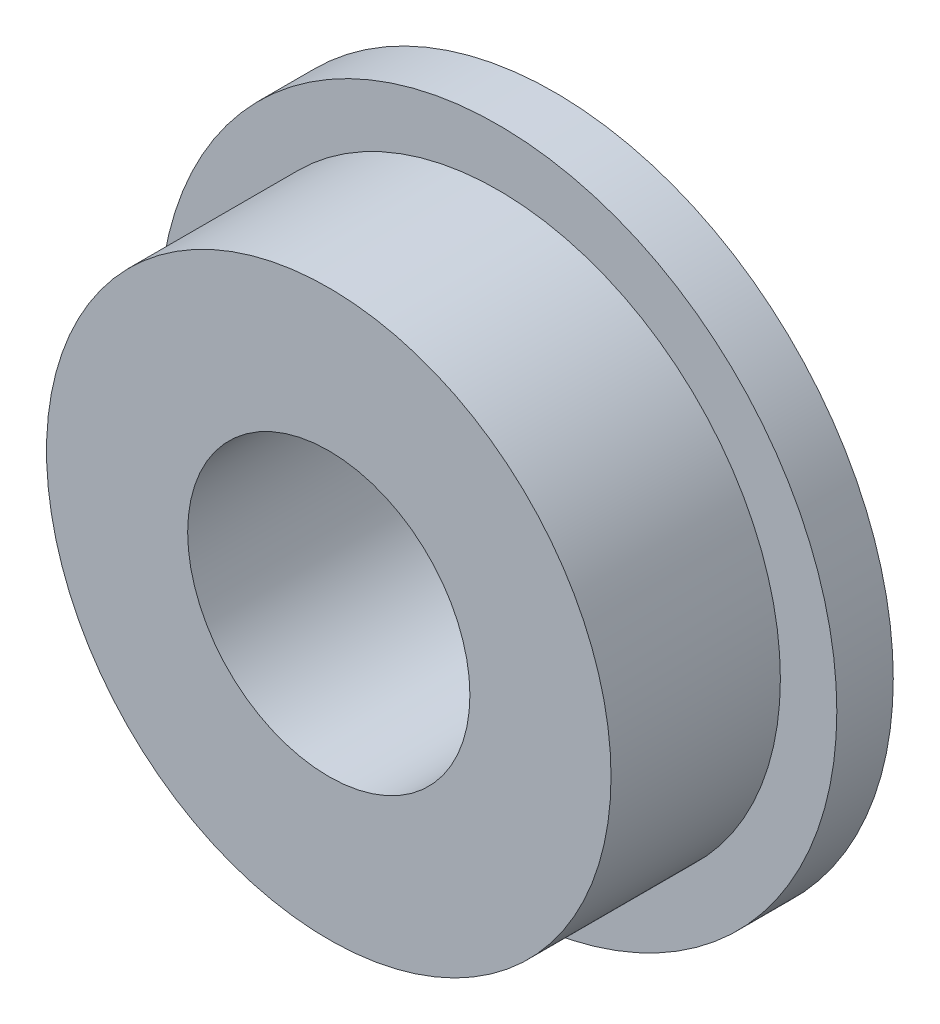
ISO-10303-21;
HEADER;
FILE_DESCRIPTION(('STEP AP214'),'2;1');
FILE_NAME('part.step','',(''),(''),'','','');
FILE_SCHEMA(('AUTOMOTIVE_DESIGN { 1 0 10303 214 1 1 1 1 }'));
ENDSEC;
DATA;
#1=APPLICATION_CONTEXT('core data for automotive mechanical design processes');
#2=APPLICATION_PROTOCOL_DEFINITION('international standard','automotive_design',2000,#1);
#3=PRODUCT_CONTEXT('',#1,'mechanical');
#4=PRODUCT('Part','Part','',(#3));
#5=PRODUCT_RELATED_PRODUCT_CATEGORY('part','',(#4));
#6=PRODUCT_DEFINITION_FORMATION('','',#4);
#7=PRODUCT_DEFINITION_CONTEXT('part definition',#1,'design');
#8=PRODUCT_DEFINITION('design','',#6,#7);
#9=PRODUCT_DEFINITION_SHAPE('','',#8);
#10=(LENGTH_UNIT() NAMED_UNIT(*) SI_UNIT(.MILLI.,.METRE.));
#11=(NAMED_UNIT(*) PLANE_ANGLE_UNIT() SI_UNIT($,.RADIAN.));
#12=(NAMED_UNIT(*) SI_UNIT($,.STERADIAN.) SOLID_ANGLE_UNIT());
#13=UNCERTAINTY_MEASURE_WITH_UNIT(LENGTH_MEASURE(1.E-05),#10,'distance_accuracy_value','');
#14=(GEOMETRIC_REPRESENTATION_CONTEXT(3) GLOBAL_UNCERTAINTY_ASSIGNED_CONTEXT((#13)) GLOBAL_UNIT_ASSIGNED_CONTEXT((#10,
#11,#12)) REPRESENTATION_CONTEXT('',''));
#15=CARTESIAN_POINT('',(0.,0.,0.));
#16=DIRECTION('',(0.,0.,1.));
#17=DIRECTION('',(1.,0.,0.));
#18=AXIS2_PLACEMENT_3D('',#15,#16,#17);
#19=CARTESIAN_POINT('',(0.,0.,1.));
#20=DIRECTION('',(0.,0.,-1.));
#21=DIRECTION('',(-1.,0.,0.));
#22=AXIS2_PLACEMENT_3D('',#19,#20,#21);
#23=CYLINDRICAL_SURFACE('',#22,6.);
#24=CARTESIAN_POINT('',(0.,0.,1.));
#25=DIRECTION('',(0.,0.,1.));
#26=DIRECTION('',(1.,0.,0.));
#27=AXIS2_PLACEMENT_3D('',#24,#25,#26);
#28=CIRCLE('',#27,6.);
#29=CARTESIAN_POINT('',(6.,0.,1.));
#30=VERTEX_POINT('',#29);
#31=EDGE_CURVE('E40',#30,#30,#28,.T.);
#32=ORIENTED_EDGE('',*,*,#31,.F.);
#33=EDGE_LOOP('',(#32));
#34=FACE_BOUND('',#33,.T.);
#35=CARTESIAN_POINT('',(0.,0.,0.));
#36=DIRECTION('',(0.,0.,1.));
#37=DIRECTION('',(1.,0.,0.));
#38=AXIS2_PLACEMENT_3D('',#35,#36,#37);
#39=CIRCLE('',#38,6.);
#40=CARTESIAN_POINT('',(6.,0.,0.));
#41=VERTEX_POINT('',#40);
#42=EDGE_CURVE('E36',#41,#41,#39,.T.);
#43=ORIENTED_EDGE('',*,*,#42,.T.);
#44=EDGE_LOOP('',(#43));
#45=FACE_BOUND('',#44,.T.);
#46=ADVANCED_FACE('F33',(#34,#45),#23,.T.);
#47=CARTESIAN_POINT('',(0.,0.,1.));
#48=DIRECTION('',(0.,0.,1.));
#49=DIRECTION('',(1.,0.,0.));
#50=AXIS2_PLACEMENT_3D('',#47,#48,#49);
#51=PLANE('',#50);
#52=CARTESIAN_POINT('',(0.,0.,1.));
#53=DIRECTION('',(0.,0.,1.));
#54=DIRECTION('',(1.,0.,0.));
#55=AXIS2_PLACEMENT_3D('',#52,#53,#54);
#56=CIRCLE('',#55,5.);
#57=CARTESIAN_POINT('',(5.,0.,1.));
#58=VERTEX_POINT('',#57);
#59=EDGE_CURVE('E10',#58,#58,#56,.T.);
#60=ORIENTED_EDGE('',*,*,#59,.F.);
#61=EDGE_LOOP('',(#60));
#62=FACE_BOUND('',#61,.T.);
#63=ORIENTED_EDGE('',*,*,#31,.T.);
#64=EDGE_LOOP('',(#63));
#65=FACE_BOUND('',#64,.T.);
#66=ADVANCED_FACE('F72',(#62,#65),#51,.T.);
#67=CARTESIAN_POINT('',(0.,0.,0.));
#68=DIRECTION('',(0.,0.,1.));
#69=DIRECTION('',(1.,0.,0.));
#70=AXIS2_PLACEMENT_3D('',#67,#68,#69);
#71=PLANE('',#70);
#72=CARTESIAN_POINT('',(0.,0.,0.));
#73=DIRECTION('',(0.,0.,1.));
#74=DIRECTION('',(1.,0.,0.));
#75=AXIS2_PLACEMENT_3D('',#72,#73,#74);
#76=CIRCLE('',#75,2.5);
#77=CARTESIAN_POINT('',(2.5,0.,0.));
#78=VERTEX_POINT('',#77);
#79=EDGE_CURVE('E49',#78,#78,#76,.T.);
#80=ORIENTED_EDGE('',*,*,#79,.T.);
#81=EDGE_LOOP('',(#80));
#82=FACE_BOUND('',#81,.T.);
#83=ORIENTED_EDGE('',*,*,#42,.F.);
#84=EDGE_LOOP('',(#83));
#85=FACE_BOUND('',#84,.T.);
#86=ADVANCED_FACE('F67',(#82,#85),#71,.F.);
#87=CARTESIAN_POINT('',(0.,0.,4.));
#88=DIRECTION('',(0.,0.,-1.));
#89=DIRECTION('',(-1.,0.,0.));
#90=AXIS2_PLACEMENT_3D('',#87,#88,#89);
#91=CYLINDRICAL_SURFACE('',#90,5.);
#92=CARTESIAN_POINT('',(0.,0.,4.));
#93=DIRECTION('',(0.,0.,1.));
#94=DIRECTION('',(1.,0.,0.));
#95=AXIS2_PLACEMENT_3D('',#92,#93,#94);
#96=CIRCLE('',#95,5.);
#97=CARTESIAN_POINT('',(5.,0.,4.));
#98=VERTEX_POINT('',#97);
#99=EDGE_CURVE('E46',#98,#98,#96,.T.);
#100=ORIENTED_EDGE('',*,*,#99,.F.);
#101=EDGE_LOOP('',(#100));
#102=FACE_BOUND('',#101,.T.);
#103=ORIENTED_EDGE('',*,*,#59,.T.);
#104=EDGE_LOOP('',(#103));
#105=FACE_BOUND('',#104,.T.);
#106=ADVANCED_FACE('F62',(#102,#105),#91,.T.);
#107=CARTESIAN_POINT('',(0.,0.,4.));
#108=DIRECTION('',(0.,0.,1.));
#109=DIRECTION('',(1.,0.,0.));
#110=AXIS2_PLACEMENT_3D('',#107,#108,#109);
#111=PLANE('',#110);
#112=CARTESIAN_POINT('',(0.,0.,4.));
#113=DIRECTION('',(0.,0.,1.));
#114=DIRECTION('',(1.,0.,0.));
#115=AXIS2_PLACEMENT_3D('',#112,#113,#114);
#116=CIRCLE('',#115,2.5);
#117=CARTESIAN_POINT('',(2.5,0.,4.));
#118=VERTEX_POINT('',#117);
#119=EDGE_CURVE('E52',#118,#118,#116,.T.);
#120=ORIENTED_EDGE('',*,*,#119,.F.);
#121=EDGE_LOOP('',(#120));
#122=FACE_BOUND('',#121,.T.);
#123=ORIENTED_EDGE('',*,*,#99,.T.);
#124=EDGE_LOOP('',(#123));
#125=FACE_BOUND('',#124,.T.);
#126=ADVANCED_FACE('F59',(#122,#125),#111,.T.);
#127=CARTESIAN_POINT('',(0.,0.,-3.));
#128=DIRECTION('',(0.,0.,1.));
#129=DIRECTION('',(1.,0.,0.));
#130=AXIS2_PLACEMENT_3D('',#127,#128,#129);
#131=CYLINDRICAL_SURFACE('',#130,2.5);
#132=ORIENTED_EDGE('',*,*,#119,.T.);
#133=EDGE_LOOP('',(#132));
#134=FACE_BOUND('',#133,.T.);
#135=ORIENTED_EDGE('',*,*,#79,.F.);
#136=EDGE_LOOP('',(#135));
#137=FACE_BOUND('',#136,.T.);
#138=ADVANCED_FACE('F56',(#134,#137),#131,.F.);
#139=CLOSED_SHELL('',(#46,#66,#86,#106,#126,#138));
#140=MANIFOLD_SOLID_BREP('B2',#139);
#141=ADVANCED_BREP_SHAPE_REPRESENTATION('',(#18,#140),#14);
#142=SHAPE_DEFINITION_REPRESENTATION(#9,#141);
ENDSEC;
END-ISO-10303-21;
